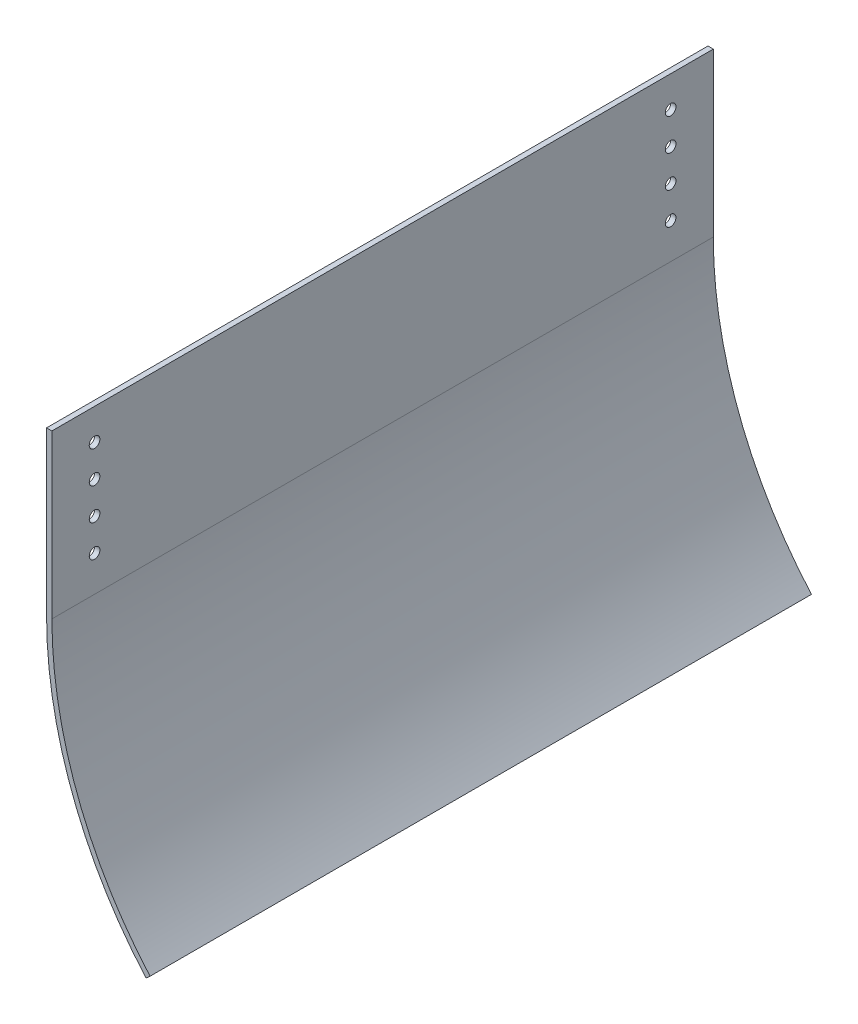
ISO-10303-21;
HEADER;
FILE_DESCRIPTION(('STEP AP214'),'2;1');
FILE_NAME('part.step','',(''),(''),'','','');
FILE_SCHEMA(('AUTOMOTIVE_DESIGN { 1 0 10303 214 1 1 1 1 }'));
ENDSEC;
DATA;
#1=APPLICATION_CONTEXT('core data for automotive mechanical design processes');
#2=APPLICATION_PROTOCOL_DEFINITION('international standard','automotive_design',2000,#1);
#3=PRODUCT_CONTEXT('',#1,'mechanical');
#4=PRODUCT('Part','Part','',(#3));
#5=PRODUCT_RELATED_PRODUCT_CATEGORY('part','',(#4));
#6=PRODUCT_DEFINITION_FORMATION('','',#4);
#7=PRODUCT_DEFINITION_CONTEXT('part definition',#1,'design');
#8=PRODUCT_DEFINITION('design','',#6,#7);
#9=PRODUCT_DEFINITION_SHAPE('','',#8);
#10=(LENGTH_UNIT() NAMED_UNIT(*) SI_UNIT(.MILLI.,.METRE.));
#11=(NAMED_UNIT(*) PLANE_ANGLE_UNIT() SI_UNIT($,.RADIAN.));
#12=(NAMED_UNIT(*) SI_UNIT($,.STERADIAN.) SOLID_ANGLE_UNIT());
#13=UNCERTAINTY_MEASURE_WITH_UNIT(LENGTH_MEASURE(1.E-05),#10,'distance_accuracy_value','');
#14=(GEOMETRIC_REPRESENTATION_CONTEXT(3) GLOBAL_UNCERTAINTY_ASSIGNED_CONTEXT((#13)) GLOBAL_UNIT_ASSIGNED_CONTEXT((#10,
#11,#12)) REPRESENTATION_CONTEXT('',''));
#15=CARTESIAN_POINT('',(0.,0.,0.));
#16=DIRECTION('',(0.,0.,1.));
#17=DIRECTION('',(1.,0.,0.));
#18=AXIS2_PLACEMENT_3D('',#15,#16,#17);
#19=CARTESIAN_POINT('',(1050.53968900498,1387.36980386778,393.7));
#20=DIRECTION('',(0.,0.,-1.));
#21=DIRECTION('',(-1.,0.,0.));
#22=AXIS2_PLACEMENT_3D('',#19,#20,#21);
#23=CYLINDRICAL_SURFACE('',#22,237.998);
#24=CARTESIAN_POINT('',(1050.53968900498,1387.36980386778,0.));
#25=DIRECTION('',(0.,0.,1.));
#26=DIRECTION('',(1.,0.,0.));
#27=AXIS2_PLACEMENT_3D('',#24,#25,#26);
#28=CIRCLE('',#27,237.998);
#29=CARTESIAN_POINT('',(812.541689004982,1387.36980386778,0.));
#30=VERTEX_POINT('',#29);
#31=CARTESIAN_POINT('',(871.757832534598,1230.27080386777,0.));
#32=VERTEX_POINT('',#31);
#33=EDGE_CURVE('E117',#30,#32,#28,.T.);
#34=ORIENTED_EDGE('',*,*,#33,.T.);
#35=DIRECTION('',(0.,0.,-1.));
#36=VECTOR('',#35,1.);
#37=CARTESIAN_POINT('',(871.757832534598,1230.27080386777,393.7));
#38=LINE('',#37,#36);
#39=CARTESIAN_POINT('',(871.757832534598,1230.27080386777,393.7));
#40=VERTEX_POINT('',#39);
#41=EDGE_CURVE('E11',#40,#32,#38,.T.);
#42=ORIENTED_EDGE('',*,*,#41,.F.);
#43=CARTESIAN_POINT('',(1050.53968900498,1387.36980386778,393.7));
#44=DIRECTION('',(0.,0.,1.));
#45=DIRECTION('',(1.,0.,0.));
#46=AXIS2_PLACEMENT_3D('',#43,#44,#45);
#47=CIRCLE('',#46,237.998);
#48=CARTESIAN_POINT('',(812.541689004982,1387.36980386778,393.7));
#49=VERTEX_POINT('',#48);
#50=EDGE_CURVE('E128',#49,#40,#47,.T.);
#51=ORIENTED_EDGE('',*,*,#50,.F.);
#52=DIRECTION('',(0.,0.,-1.));
#53=VECTOR('',#52,1.);
#54=CARTESIAN_POINT('',(812.541689004982,1387.36980386778,393.7));
#55=LINE('',#54,#53);
#56=EDGE_CURVE('E113',#49,#30,#55,.T.);
#57=ORIENTED_EDGE('',*,*,#56,.T.);
#58=EDGE_LOOP('',(#34,#42,#51,#57));
#59=FACE_BOUND('',#58,.T.);
#60=ADVANCED_FACE('F33',(#59),#23,.T.);
#61=CARTESIAN_POINT('',(874.142862636925,1232.36657494568,393.7));
#62=DIRECTION('',(-0.660085378868772,0.751190583409876,0.));
#63=DIRECTION('',(-0.751190583409876,-0.660085378868772,0.));
#64=AXIS2_PLACEMENT_3D('',#61,#62,#63);
#65=PLANE('',#64);
#66=DIRECTION('',(0.751190583409876,0.660085378868772,0.));
#67=VECTOR('',#66,1.);
#68=CARTESIAN_POINT('',(874.142862636925,1232.36657494568,0.));
#69=LINE('',#68,#67);
#70=CARTESIAN_POINT('',(874.142862636925,1232.36657494568,0.));
#71=VERTEX_POINT('',#70);
#72=EDGE_CURVE('E120',#32,#71,#69,.T.);
#73=ORIENTED_EDGE('',*,*,#72,.T.);
#74=DIRECTION('',(0.,0.,-1.));
#75=VECTOR('',#74,1.);
#76=CARTESIAN_POINT('',(874.142862636925,1232.36657494568,393.7));
#77=LINE('',#76,#75);
#78=CARTESIAN_POINT('',(874.142862636925,1232.36657494568,393.7));
#79=VERTEX_POINT('',#78);
#80=EDGE_CURVE('E41',#79,#71,#77,.T.);
#81=ORIENTED_EDGE('',*,*,#80,.F.);
#82=DIRECTION('',(0.751190583409876,0.660085378868772,0.));
#83=VECTOR('',#82,1.);
#84=CARTESIAN_POINT('',(874.142862636925,1232.36657494568,393.7));
#85=LINE('',#84,#83);
#86=EDGE_CURVE('E86',#40,#79,#85,.T.);
#87=ORIENTED_EDGE('',*,*,#86,.F.);
#88=ORIENTED_EDGE('',*,*,#41,.T.);
#89=EDGE_LOOP('',(#73,#81,#87,#88));
#90=FACE_BOUND('',#89,.T.);
#91=ADVANCED_FACE('F155',(#90),#65,.F.);
#92=CARTESIAN_POINT('',(1050.53968900498,1387.36980386778,393.7));
#93=DIRECTION('',(0.,0.,-1.));
#94=DIRECTION('',(-1.,0.,0.));
#95=AXIS2_PLACEMENT_3D('',#92,#93,#94);
#96=CYLINDRICAL_SURFACE('',#95,234.823);
#97=CARTESIAN_POINT('',(1050.53968900498,1387.36980386778,0.));
#98=DIRECTION('',(0.,0.,-1.));
#99=DIRECTION('',(1.,0.,0.));
#100=AXIS2_PLACEMENT_3D('',#97,#98,#99);
#101=CIRCLE('',#100,234.823);
#102=CARTESIAN_POINT('',(815.716689004982,1387.36980386778,0.));
#103=VERTEX_POINT('',#102);
#104=EDGE_CURVE('E123',#71,#103,#101,.T.);
#105=ORIENTED_EDGE('',*,*,#104,.T.);
#106=DIRECTION('',(0.,0.,-1.));
#107=VECTOR('',#106,1.);
#108=CARTESIAN_POINT('',(815.716689004982,1387.36980386778,393.7));
#109=LINE('',#108,#107);
#110=CARTESIAN_POINT('',(815.716689004982,1387.36980386778,393.7));
#111=VERTEX_POINT('',#110);
#112=EDGE_CURVE('E108',#111,#103,#109,.T.);
#113=ORIENTED_EDGE('',*,*,#112,.F.);
#114=CARTESIAN_POINT('',(1050.53968900498,1387.36980386778,393.7));
#115=DIRECTION('',(0.,0.,-1.));
#116=DIRECTION('',(1.,0.,0.));
#117=AXIS2_PLACEMENT_3D('',#114,#115,#116);
#118=CIRCLE('',#117,234.823);
#119=EDGE_CURVE('E99',#79,#111,#118,.T.);
#120=ORIENTED_EDGE('',*,*,#119,.F.);
#121=ORIENTED_EDGE('',*,*,#80,.T.);
#122=EDGE_LOOP('',(#105,#113,#120,#121));
#123=FACE_BOUND('',#122,.T.);
#124=ADVANCED_FACE('F134',(#123),#96,.F.);
#125=CARTESIAN_POINT('',(815.716689004982,1387.36980386778,393.7));
#126=DIRECTION('',(-1.,0.,0.));
#127=DIRECTION('',(0.,0.,1.));
#128=AXIS2_PLACEMENT_3D('',#125,#126,#127);
#129=PLANE('',#128);
#130=CARTESIAN_POINT('',(815.716689004982,1465.72880386777,368.3));
#131=DIRECTION('',(1.,0.,0.));
#132=DIRECTION('',(0.,0.,-1.));
#133=AXIS2_PLACEMENT_3D('',#130,#131,#132);
#134=CIRCLE('',#133,3.17499999999978);
#135=CARTESIAN_POINT('',(815.716689004982,1465.72880386777,365.125));
#136=VERTEX_POINT('',#135);
#137=EDGE_CURVE('E171',#136,#136,#134,.T.);
#138=ORIENTED_EDGE('',*,*,#137,.F.);
#139=EDGE_LOOP('',(#138));
#140=FACE_BOUND('',#139,.T.);
#141=CARTESIAN_POINT('',(815.716689004982,1408.57880386777,25.4));
#142=DIRECTION('',(1.,0.,0.));
#143=DIRECTION('',(0.,0.,-1.));
#144=AXIS2_PLACEMENT_3D('',#141,#142,#143);
#145=CIRCLE('',#144,3.17500000000006);
#146=CARTESIAN_POINT('',(815.716689004982,1408.57880386777,22.2249999999999));
#147=VERTEX_POINT('',#146);
#148=EDGE_CURVE('E175',#147,#147,#145,.T.);
#149=ORIENTED_EDGE('',*,*,#148,.F.);
#150=EDGE_LOOP('',(#149));
#151=FACE_BOUND('',#150,.T.);
#152=CARTESIAN_POINT('',(815.716689004982,1427.62880386777,25.4));
#153=DIRECTION('',(1.,0.,0.));
#154=DIRECTION('',(0.,0.,-1.));
#155=AXIS2_PLACEMENT_3D('',#152,#153,#154);
#156=CIRCLE('',#155,3.17500000000006);
#157=CARTESIAN_POINT('',(815.716689004982,1427.62880386777,22.2249999999999));
#158=VERTEX_POINT('',#157);
#159=EDGE_CURVE('E179',#158,#158,#156,.T.);
#160=ORIENTED_EDGE('',*,*,#159,.F.);
#161=EDGE_LOOP('',(#160));
#162=FACE_BOUND('',#161,.T.);
#163=CARTESIAN_POINT('',(815.716689004982,1446.67880386777,25.4));
#164=DIRECTION('',(1.,0.,0.));
#165=DIRECTION('',(0.,0.,-1.));
#166=AXIS2_PLACEMENT_3D('',#163,#164,#165);
#167=CIRCLE('',#166,3.17500000000006);
#168=CARTESIAN_POINT('',(815.716689004982,1446.67880386777,22.2249999999999));
#169=VERTEX_POINT('',#168);
#170=EDGE_CURVE('E183',#169,#169,#167,.T.);
#171=ORIENTED_EDGE('',*,*,#170,.F.);
#172=EDGE_LOOP('',(#171));
#173=FACE_BOUND('',#172,.T.);
#174=CARTESIAN_POINT('',(815.716689004982,1465.72880386777,25.4));
#175=DIRECTION('',(1.,0.,0.));
#176=DIRECTION('',(0.,0.,-1.));
#177=AXIS2_PLACEMENT_3D('',#174,#175,#176);
#178=CIRCLE('',#177,3.17500000000006);
#179=CARTESIAN_POINT('',(815.716689004982,1465.72880386777,22.2249999999999));
#180=VERTEX_POINT('',#179);
#181=EDGE_CURVE('E187',#180,#180,#178,.T.);
#182=ORIENTED_EDGE('',*,*,#181,.F.);
#183=EDGE_LOOP('',(#182));
#184=FACE_BOUND('',#183,.T.);
#185=CARTESIAN_POINT('',(815.716689004982,1408.57880386777,368.3));
#186=DIRECTION('',(1.,0.,0.));
#187=DIRECTION('',(0.,0.,-1.));
#188=AXIS2_PLACEMENT_3D('',#185,#186,#187);
#189=CIRCLE('',#188,3.17499999999983);
#190=CARTESIAN_POINT('',(815.716689004982,1408.57880386777,365.125));
#191=VERTEX_POINT('',#190);
#192=EDGE_CURVE('E191',#191,#191,#189,.T.);
#193=ORIENTED_EDGE('',*,*,#192,.F.);
#194=EDGE_LOOP('',(#193));
#195=FACE_BOUND('',#194,.T.);
#196=CARTESIAN_POINT('',(815.716689004982,1427.62880386777,368.3));
#197=DIRECTION('',(1.,0.,0.));
#198=DIRECTION('',(0.,0.,-1.));
#199=AXIS2_PLACEMENT_3D('',#196,#197,#198);
#200=CIRCLE('',#199,3.17499999999983);
#201=CARTESIAN_POINT('',(815.716689004982,1427.62880386777,365.125));
#202=VERTEX_POINT('',#201);
#203=EDGE_CURVE('E195',#202,#202,#200,.T.);
#204=ORIENTED_EDGE('',*,*,#203,.F.);
#205=EDGE_LOOP('',(#204));
#206=FACE_BOUND('',#205,.T.);
#207=CARTESIAN_POINT('',(815.716689004982,1446.67880386777,368.3));
#208=DIRECTION('',(1.,0.,0.));
#209=DIRECTION('',(0.,0.,-1.));
#210=AXIS2_PLACEMENT_3D('',#207,#208,#209);
#211=CIRCLE('',#210,3.17499999999983);
#212=CARTESIAN_POINT('',(815.716689004982,1446.67880386777,365.125));
#213=VERTEX_POINT('',#212);
#214=EDGE_CURVE('E198',#213,#213,#211,.T.);
#215=ORIENTED_EDGE('',*,*,#214,.F.);
#216=EDGE_LOOP('',(#215));
#217=FACE_BOUND('',#216,.T.);
#218=DIRECTION('',(0.,1.,0.));
#219=VECTOR('',#218,1.);
#220=CARTESIAN_POINT('',(815.716689004982,1387.36980386778,0.));
#221=LINE('',#220,#219);
#222=CARTESIAN_POINT('',(815.716689004982,1484.27080386777,0.));
#223=VERTEX_POINT('',#222);
#224=EDGE_CURVE('E107',#103,#223,#221,.T.);
#225=ORIENTED_EDGE('',*,*,#224,.T.);
#226=DIRECTION('',(0.,0.,-1.));
#227=VECTOR('',#226,1.);
#228=CARTESIAN_POINT('',(815.716689004982,1484.27080386777,393.7));
#229=LINE('',#228,#227);
#230=CARTESIAN_POINT('',(815.716689004982,1484.27080386777,393.7));
#231=VERTEX_POINT('',#230);
#232=EDGE_CURVE('E104',#231,#223,#229,.T.);
#233=ORIENTED_EDGE('',*,*,#232,.F.);
#234=DIRECTION('',(0.,1.,0.));
#235=VECTOR('',#234,1.);
#236=CARTESIAN_POINT('',(815.716689004982,1387.36980386778,393.7));
#237=LINE('',#236,#235);
#238=EDGE_CURVE('E93',#111,#231,#237,.T.);
#239=ORIENTED_EDGE('',*,*,#238,.F.);
#240=ORIENTED_EDGE('',*,*,#112,.T.);
#241=EDGE_LOOP('',(#225,#233,#239,#240));
#242=FACE_BOUND('',#241,.T.);
#243=ADVANCED_FACE('F105',(#140,#151,#162,#173,#184,#195,#206,#217,#242),#129,.F.);
#244=CARTESIAN_POINT('',(812.541689004982,1484.27080386777,393.7));
#245=DIRECTION('',(0.,-1.,0.));
#246=DIRECTION('',(0.,0.,-1.));
#247=AXIS2_PLACEMENT_3D('',#244,#245,#246);
#248=PLANE('',#247);
#249=DIRECTION('',(-1.,0.,0.));
#250=VECTOR('',#249,1.);
#251=CARTESIAN_POINT('',(812.541689004982,1484.27080386777,0.));
#252=LINE('',#251,#250);
#253=CARTESIAN_POINT('',(812.541689004982,1484.27080386777,0.));
#254=VERTEX_POINT('',#253);
#255=EDGE_CURVE('E72',#223,#254,#252,.T.);
#256=ORIENTED_EDGE('',*,*,#255,.T.);
#257=DIRECTION('',(0.,0.,-1.));
#258=VECTOR('',#257,1.);
#259=CARTESIAN_POINT('',(812.541689004982,1484.27080386777,393.7));
#260=LINE('',#259,#258);
#261=CARTESIAN_POINT('',(812.541689004982,1484.27080386777,393.7));
#262=VERTEX_POINT('',#261);
#263=EDGE_CURVE('E109',#262,#254,#260,.T.);
#264=ORIENTED_EDGE('',*,*,#263,.F.);
#265=DIRECTION('',(-1.,0.,0.));
#266=VECTOR('',#265,1.);
#267=CARTESIAN_POINT('',(812.541689004982,1484.27080386777,393.7));
#268=LINE('',#267,#266);
#269=EDGE_CURVE('E97',#231,#262,#268,.T.);
#270=ORIENTED_EDGE('',*,*,#269,.F.);
#271=ORIENTED_EDGE('',*,*,#232,.T.);
#272=EDGE_LOOP('',(#256,#264,#270,#271));
#273=FACE_BOUND('',#272,.T.);
#274=ADVANCED_FACE('F111',(#273),#248,.F.);
#275=CARTESIAN_POINT('',(812.541689004982,1387.36980386778,393.7));
#276=DIRECTION('',(1.,0.,0.));
#277=DIRECTION('',(0.,0.,-1.));
#278=AXIS2_PLACEMENT_3D('',#275,#276,#277);
#279=PLANE('',#278);
#280=CARTESIAN_POINT('',(812.541689004982,1465.72880386777,368.3));
#281=DIRECTION('',(1.,0.,0.));
#282=DIRECTION('',(0.,0.,-1.));
#283=AXIS2_PLACEMENT_3D('',#280,#281,#282);
#284=CIRCLE('',#283,3.17499999999978);
#285=CARTESIAN_POINT('',(812.541689004982,1465.72880386777,365.125));
#286=VERTEX_POINT('',#285);
#287=EDGE_CURVE('E228',#286,#286,#284,.T.);
#288=ORIENTED_EDGE('',*,*,#287,.T.);
#289=EDGE_LOOP('',(#288));
#290=FACE_BOUND('',#289,.T.);
#291=CARTESIAN_POINT('',(812.541689004982,1408.57880386777,25.4));
#292=DIRECTION('',(1.,0.,0.));
#293=DIRECTION('',(0.,0.,-1.));
#294=AXIS2_PLACEMENT_3D('',#291,#292,#293);
#295=CIRCLE('',#294,3.17500000000006);
#296=CARTESIAN_POINT('',(812.541689004982,1408.57880386777,22.2249999999999));
#297=VERTEX_POINT('',#296);
#298=EDGE_CURVE('E224',#297,#297,#295,.T.);
#299=ORIENTED_EDGE('',*,*,#298,.T.);
#300=EDGE_LOOP('',(#299));
#301=FACE_BOUND('',#300,.T.);
#302=CARTESIAN_POINT('',(812.541689004982,1427.62880386777,25.4));
#303=DIRECTION('',(1.,0.,0.));
#304=DIRECTION('',(0.,0.,-1.));
#305=AXIS2_PLACEMENT_3D('',#302,#303,#304);
#306=CIRCLE('',#305,3.17500000000006);
#307=CARTESIAN_POINT('',(812.541689004982,1427.62880386777,22.2249999999999));
#308=VERTEX_POINT('',#307);
#309=EDGE_CURVE('E220',#308,#308,#306,.T.);
#310=ORIENTED_EDGE('',*,*,#309,.T.);
#311=EDGE_LOOP('',(#310));
#312=FACE_BOUND('',#311,.T.);
#313=CARTESIAN_POINT('',(812.541689004982,1446.67880386777,25.4));
#314=DIRECTION('',(1.,0.,0.));
#315=DIRECTION('',(0.,0.,-1.));
#316=AXIS2_PLACEMENT_3D('',#313,#314,#315);
#317=CIRCLE('',#316,3.17500000000006);
#318=CARTESIAN_POINT('',(812.541689004982,1446.67880386777,22.2249999999999));
#319=VERTEX_POINT('',#318);
#320=EDGE_CURVE('E216',#319,#319,#317,.T.);
#321=ORIENTED_EDGE('',*,*,#320,.T.);
#322=EDGE_LOOP('',(#321));
#323=FACE_BOUND('',#322,.T.);
#324=CARTESIAN_POINT('',(812.541689004982,1465.72880386777,25.4));
#325=DIRECTION('',(1.,0.,0.));
#326=DIRECTION('',(0.,0.,-1.));
#327=AXIS2_PLACEMENT_3D('',#324,#325,#326);
#328=CIRCLE('',#327,3.17500000000006);
#329=CARTESIAN_POINT('',(812.541689004982,1465.72880386777,22.2249999999999));
#330=VERTEX_POINT('',#329);
#331=EDGE_CURVE('E212',#330,#330,#328,.T.);
#332=ORIENTED_EDGE('',*,*,#331,.T.);
#333=EDGE_LOOP('',(#332));
#334=FACE_BOUND('',#333,.T.);
#335=CARTESIAN_POINT('',(812.541689004982,1408.57880386777,368.3));
#336=DIRECTION('',(1.,0.,0.));
#337=DIRECTION('',(0.,0.,-1.));
#338=AXIS2_PLACEMENT_3D('',#335,#336,#337);
#339=CIRCLE('',#338,3.17499999999983);
#340=CARTESIAN_POINT('',(812.541689004982,1408.57880386777,365.125));
#341=VERTEX_POINT('',#340);
#342=EDGE_CURVE('E209',#341,#341,#339,.T.);
#343=ORIENTED_EDGE('',*,*,#342,.T.);
#344=EDGE_LOOP('',(#343));
#345=FACE_BOUND('',#344,.T.);
#346=CARTESIAN_POINT('',(812.541689004982,1427.62880386777,368.3));
#347=DIRECTION('',(1.,0.,0.));
#348=DIRECTION('',(0.,0.,-1.));
#349=AXIS2_PLACEMENT_3D('',#346,#347,#348);
#350=CIRCLE('',#349,3.17499999999983);
#351=CARTESIAN_POINT('',(812.541689004982,1427.62880386777,365.125));
#352=VERTEX_POINT('',#351);
#353=EDGE_CURVE('E200',#352,#352,#350,.T.);
#354=ORIENTED_EDGE('',*,*,#353,.T.);
#355=EDGE_LOOP('',(#354));
#356=FACE_BOUND('',#355,.T.);
#357=CARTESIAN_POINT('',(812.541689004982,1446.67880386777,368.3));
#358=DIRECTION('',(1.,0.,0.));
#359=DIRECTION('',(0.,0.,-1.));
#360=AXIS2_PLACEMENT_3D('',#357,#358,#359);
#361=CIRCLE('',#360,3.17499999999983);
#362=CARTESIAN_POINT('',(812.541689004982,1446.67880386777,365.125));
#363=VERTEX_POINT('',#362);
#364=EDGE_CURVE('E121',#363,#363,#361,.T.);
#365=ORIENTED_EDGE('',*,*,#364,.T.);
#366=EDGE_LOOP('',(#365));
#367=FACE_BOUND('',#366,.T.);
#368=DIRECTION('',(0.,-1.,0.));
#369=VECTOR('',#368,1.);
#370=CARTESIAN_POINT('',(812.541689004982,1387.36980386778,0.));
#371=LINE('',#370,#369);
#372=EDGE_CURVE('E78',#254,#30,#371,.T.);
#373=ORIENTED_EDGE('',*,*,#372,.T.);
#374=ORIENTED_EDGE('',*,*,#56,.F.);
#375=DIRECTION('',(0.,-1.,0.));
#376=VECTOR('',#375,1.);
#377=CARTESIAN_POINT('',(812.541689004982,1387.36980386778,393.7));
#378=LINE('',#377,#376);
#379=EDGE_CURVE('E49',#262,#49,#378,.T.);
#380=ORIENTED_EDGE('',*,*,#379,.F.);
#381=ORIENTED_EDGE('',*,*,#263,.T.);
#382=EDGE_LOOP('',(#373,#374,#380,#381));
#383=FACE_BOUND('',#382,.T.);
#384=ADVANCED_FACE('F141',(#290,#301,#312,#323,#334,#345,#356,#367,#383),#279,.F.);
#385=CARTESIAN_POINT('',(1050.53968900498,1387.36980386778,393.7));
#386=DIRECTION('',(0.,0.,1.));
#387=DIRECTION('',(1.,0.,0.));
#388=AXIS2_PLACEMENT_3D('',#385,#386,#387);
#389=PLANE('',#388);
#390=ORIENTED_EDGE('',*,*,#50,.T.);
#391=ORIENTED_EDGE('',*,*,#86,.T.);
#392=ORIENTED_EDGE('',*,*,#119,.T.);
#393=ORIENTED_EDGE('',*,*,#238,.T.);
#394=ORIENTED_EDGE('',*,*,#269,.T.);
#395=ORIENTED_EDGE('',*,*,#379,.T.);
#396=EDGE_LOOP('',(#390,#391,#392,#393,#394,#395));
#397=FACE_BOUND('',#396,.T.);
#398=ADVANCED_FACE('F95',(#397),#389,.T.);
#399=CARTESIAN_POINT('',(1050.53968900498,1387.36980386778,0.));
#400=DIRECTION('',(0.,0.,1.));
#401=DIRECTION('',(1.,0.,0.));
#402=AXIS2_PLACEMENT_3D('',#399,#400,#401);
#403=PLANE('',#402);
#404=ORIENTED_EDGE('',*,*,#33,.F.);
#405=ORIENTED_EDGE('',*,*,#372,.F.);
#406=ORIENTED_EDGE('',*,*,#255,.F.);
#407=ORIENTED_EDGE('',*,*,#224,.F.);
#408=ORIENTED_EDGE('',*,*,#104,.F.);
#409=ORIENTED_EDGE('',*,*,#72,.F.);
#410=EDGE_LOOP('',(#404,#405,#406,#407,#408,#409));
#411=FACE_BOUND('',#410,.T.);
#412=ADVANCED_FACE('F137',(#411),#403,.F.);
#413=CARTESIAN_POINT('',(812.541689004982,1446.67880386777,368.3));
#414=DIRECTION('',(1.,0.,0.));
#415=DIRECTION('',(0.,0.,-1.));
#416=AXIS2_PLACEMENT_3D('',#413,#414,#415);
#417=CYLINDRICAL_SURFACE('',#416,3.17499999999983);
#418=ORIENTED_EDGE('',*,*,#364,.F.);
#419=EDGE_LOOP('',(#418));
#420=FACE_BOUND('',#419,.T.);
#421=ORIENTED_EDGE('',*,*,#214,.T.);
#422=EDGE_LOOP('',(#421));
#423=FACE_BOUND('',#422,.T.);
#424=ADVANCED_FACE('F264',(#420,#423),#417,.F.);
#425=CARTESIAN_POINT('',(812.541689004982,1427.62880386777,368.3));
#426=DIRECTION('',(1.,0.,0.));
#427=DIRECTION('',(0.,0.,-1.));
#428=AXIS2_PLACEMENT_3D('',#425,#426,#427);
#429=CYLINDRICAL_SURFACE('',#428,3.17499999999983);
#430=ORIENTED_EDGE('',*,*,#353,.F.);
#431=EDGE_LOOP('',(#430));
#432=FACE_BOUND('',#431,.T.);
#433=ORIENTED_EDGE('',*,*,#203,.T.);
#434=EDGE_LOOP('',(#433));
#435=FACE_BOUND('',#434,.T.);
#436=ADVANCED_FACE('F260',(#432,#435),#429,.F.);
#437=CARTESIAN_POINT('',(812.541689004982,1408.57880386777,368.3));
#438=DIRECTION('',(1.,0.,0.));
#439=DIRECTION('',(0.,0.,-1.));
#440=AXIS2_PLACEMENT_3D('',#437,#438,#439);
#441=CYLINDRICAL_SURFACE('',#440,3.17499999999983);
#442=ORIENTED_EDGE('',*,*,#342,.F.);
#443=EDGE_LOOP('',(#442));
#444=FACE_BOUND('',#443,.T.);
#445=ORIENTED_EDGE('',*,*,#192,.T.);
#446=EDGE_LOOP('',(#445));
#447=FACE_BOUND('',#446,.T.);
#448=ADVANCED_FACE('F256',(#444,#447),#441,.F.);
#449=CARTESIAN_POINT('',(812.541689004982,1465.72880386777,25.4));
#450=DIRECTION('',(1.,0.,0.));
#451=DIRECTION('',(0.,0.,-1.));
#452=AXIS2_PLACEMENT_3D('',#449,#450,#451);
#453=CYLINDRICAL_SURFACE('',#452,3.17500000000006);
#454=ORIENTED_EDGE('',*,*,#331,.F.);
#455=EDGE_LOOP('',(#454));
#456=FACE_BOUND('',#455,.T.);
#457=ORIENTED_EDGE('',*,*,#181,.T.);
#458=EDGE_LOOP('',(#457));
#459=FACE_BOUND('',#458,.T.);
#460=ADVANCED_FACE('F252',(#456,#459),#453,.F.);
#461=CARTESIAN_POINT('',(812.541689004982,1446.67880386777,25.4));
#462=DIRECTION('',(1.,0.,0.));
#463=DIRECTION('',(0.,0.,-1.));
#464=AXIS2_PLACEMENT_3D('',#461,#462,#463);
#465=CYLINDRICAL_SURFACE('',#464,3.17500000000006);
#466=ORIENTED_EDGE('',*,*,#320,.F.);
#467=EDGE_LOOP('',(#466));
#468=FACE_BOUND('',#467,.T.);
#469=ORIENTED_EDGE('',*,*,#170,.T.);
#470=EDGE_LOOP('',(#469));
#471=FACE_BOUND('',#470,.T.);
#472=ADVANCED_FACE('F248',(#468,#471),#465,.F.);
#473=CARTESIAN_POINT('',(812.541689004982,1427.62880386777,25.4));
#474=DIRECTION('',(1.,0.,0.));
#475=DIRECTION('',(0.,0.,-1.));
#476=AXIS2_PLACEMENT_3D('',#473,#474,#475);
#477=CYLINDRICAL_SURFACE('',#476,3.17500000000006);
#478=ORIENTED_EDGE('',*,*,#309,.F.);
#479=EDGE_LOOP('',(#478));
#480=FACE_BOUND('',#479,.T.);
#481=ORIENTED_EDGE('',*,*,#159,.T.);
#482=EDGE_LOOP('',(#481));
#483=FACE_BOUND('',#482,.T.);
#484=ADVANCED_FACE('F242',(#480,#483),#477,.F.);
#485=CARTESIAN_POINT('',(812.541689004982,1408.57880386777,25.4));
#486=DIRECTION('',(1.,0.,0.));
#487=DIRECTION('',(0.,0.,-1.));
#488=AXIS2_PLACEMENT_3D('',#485,#486,#487);
#489=CYLINDRICAL_SURFACE('',#488,3.17500000000006);
#490=ORIENTED_EDGE('',*,*,#298,.F.);
#491=EDGE_LOOP('',(#490));
#492=FACE_BOUND('',#491,.T.);
#493=ORIENTED_EDGE('',*,*,#148,.T.);
#494=EDGE_LOOP('',(#493));
#495=FACE_BOUND('',#494,.T.);
#496=ADVANCED_FACE('F237',(#492,#495),#489,.F.);
#497=CARTESIAN_POINT('',(812.541689004982,1465.72880386777,368.3));
#498=DIRECTION('',(1.,0.,0.));
#499=DIRECTION('',(0.,0.,-1.));
#500=AXIS2_PLACEMENT_3D('',#497,#498,#499);
#501=CYLINDRICAL_SURFACE('',#500,3.17499999999978);
#502=ORIENTED_EDGE('',*,*,#287,.F.);
#503=EDGE_LOOP('',(#502));
#504=FACE_BOUND('',#503,.T.);
#505=ORIENTED_EDGE('',*,*,#137,.T.);
#506=EDGE_LOOP('',(#505));
#507=FACE_BOUND('',#506,.T.);
#508=ADVANCED_FACE('F234',(#504,#507),#501,.F.);
#509=CLOSED_SHELL('',(#60,#91,#124,#243,#274,#384,#398,#412,#424,#436,#448,#460,#472,#484,#496,#508));
#510=MANIFOLD_SOLID_BREP('B2',#509);
#511=ADVANCED_BREP_SHAPE_REPRESENTATION('',(#18,#510),#14);
#512=SHAPE_DEFINITION_REPRESENTATION(#9,#511);
ENDSEC;
END-ISO-10303-21;
